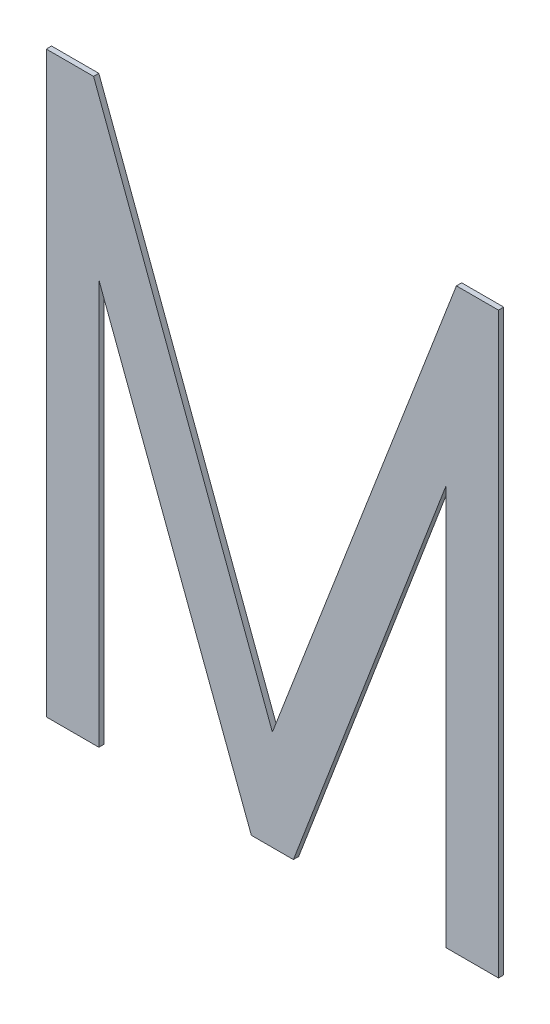
ISO-10303-21;
HEADER;
FILE_DESCRIPTION(('STEP AP214'),'2;1');
FILE_NAME('part.step','',(''),(''),'','','');
FILE_SCHEMA(('AUTOMOTIVE_DESIGN { 1 0 10303 214 1 1 1 1 }'));
ENDSEC;
DATA;
#1=APPLICATION_CONTEXT('core data for automotive mechanical design processes');
#2=APPLICATION_PROTOCOL_DEFINITION('international standard','automotive_design',2000,#1);
#3=PRODUCT_CONTEXT('',#1,'mechanical');
#4=PRODUCT('Part','Part','',(#3));
#5=PRODUCT_RELATED_PRODUCT_CATEGORY('part','',(#4));
#6=PRODUCT_DEFINITION_FORMATION('','',#4);
#7=PRODUCT_DEFINITION_CONTEXT('part definition',#1,'design');
#8=PRODUCT_DEFINITION('design','',#6,#7);
#9=PRODUCT_DEFINITION_SHAPE('','',#8);
#10=(LENGTH_UNIT() NAMED_UNIT(*) SI_UNIT(.MILLI.,.METRE.));
#11=(NAMED_UNIT(*) PLANE_ANGLE_UNIT() SI_UNIT($,.RADIAN.));
#12=(NAMED_UNIT(*) SI_UNIT($,.STERADIAN.) SOLID_ANGLE_UNIT());
#13=UNCERTAINTY_MEASURE_WITH_UNIT(LENGTH_MEASURE(1.E-05),#10,'distance_accuracy_value','');
#14=(GEOMETRIC_REPRESENTATION_CONTEXT(3) GLOBAL_UNCERTAINTY_ASSIGNED_CONTEXT((#13)) GLOBAL_UNIT_ASSIGNED_CONTEXT((#10,
#11,#12)) REPRESENTATION_CONTEXT('',''));
#15=CARTESIAN_POINT('',(0.,0.,0.));
#16=DIRECTION('',(0.,0.,1.));
#17=DIRECTION('',(1.,0.,0.));
#18=AXIS2_PLACEMENT_3D('',#15,#16,#17);
#19=CARTESIAN_POINT('',(-0.42999914,-0.5499989,0.01));
#20=DIRECTION('',(0.,0.,1.));
#21=DIRECTION('',(1.,0.,0.));
#22=AXIS2_PLACEMENT_3D('',#19,#20,#21);
#23=PLANE('',#22);
#24=DIRECTION('',(1.,0.,0.));
#25=VECTOR('',#24,1.);
#26=CARTESIAN_POINT('',(-0.42999914,0.55000144,0.01));
#27=LINE('',#26,#25);
#28=CARTESIAN_POINT('',(-0.42999914,0.55000144,0.01));
#29=VERTEX_POINT('',#28);
#30=CARTESIAN_POINT('',(-0.33999932,0.55000144,0.01));
#31=VERTEX_POINT('',#30);
#32=EDGE_CURVE('E167',#29,#31,#27,.T.);
#33=ORIENTED_EDGE('',*,*,#32,.F.);
#34=DIRECTION('',(0.,1.,0.));
#35=VECTOR('',#34,1.);
#36=CARTESIAN_POINT('',(-0.42999914,-0.5499989,0.01));
#37=LINE('',#36,#35);
#38=CARTESIAN_POINT('',(-0.42999914,-0.5499989,0.01));
#39=VERTEX_POINT('',#38);
#40=EDGE_CURVE('E124',#39,#29,#37,.T.);
#41=ORIENTED_EDGE('',*,*,#40,.F.);
#42=DIRECTION('',(1.,0.,0.));
#43=VECTOR('',#42,1.);
#44=CARTESIAN_POINT('',(-0.32999934,-0.5499989,0.01));
#45=LINE('',#44,#43);
#46=CARTESIAN_POINT('',(-0.32999934,-0.5499989,0.01));
#47=VERTEX_POINT('',#46);
#48=EDGE_CURVE('E20',#47,#39,#45,.F.);
#49=ORIENTED_EDGE('',*,*,#48,.F.);
#50=DIRECTION('',(0.,1.,0.));
#51=VECTOR('',#50,1.);
#52=CARTESIAN_POINT('',(-0.32999934,0.2200021,0.01));
#53=LINE('',#52,#51);
#54=CARTESIAN_POINT('',(-0.329999339999934,0.220002100000025,0.01));
#55=VERTEX_POINT('',#54);
#56=EDGE_CURVE('E113',#55,#47,#53,.F.);
#57=ORIENTED_EDGE('',*,*,#56,.F.);
#58=DIRECTION('',(0.352453971735885,-0.935829149902695,0.));
#59=VECTOR('',#58,1.);
#60=CARTESIAN_POINT('',(-0.03999991999999,-0.5499989,0.01));
#61=LINE('',#60,#59);
#62=CARTESIAN_POINT('',(-0.03999991999999,-0.5499989,0.01));
#63=VERTEX_POINT('',#62);
#64=EDGE_CURVE('E108',#63,#55,#61,.F.);
#65=ORIENTED_EDGE('',*,*,#64,.F.);
#66=DIRECTION('',(1.,0.,0.));
#67=VECTOR('',#66,1.);
#68=CARTESIAN_POINT('',(0.03999992000001,-0.5499989,0.01));
#69=LINE('',#68,#67);
#70=CARTESIAN_POINT('',(0.0399999199999626,-0.549998899999982,0.01));
#71=VERTEX_POINT('',#70);
#72=EDGE_CURVE('E135',#71,#63,#69,.F.);
#73=ORIENTED_EDGE('',*,*,#72,.F.);
#74=DIRECTION('',(0.356505441932937,0.934293246187834,0.));
#75=VECTOR('',#74,1.);
#76=CARTESIAN_POINT('',(0.32999934,0.21000212,0.01));
#77=LINE('',#76,#75);
#78=CARTESIAN_POINT('',(0.32999934,0.21000212,0.01));
#79=VERTEX_POINT('',#78);
#80=EDGE_CURVE('E139',#79,#71,#77,.F.);
#81=ORIENTED_EDGE('',*,*,#80,.F.);
#82=DIRECTION('',(0.,1.,0.));
#83=VECTOR('',#82,1.);
#84=CARTESIAN_POINT('',(0.32999934,-0.5499989,0.01));
#85=LINE('',#84,#83);
#86=CARTESIAN_POINT('',(0.32999934,-0.5499989,0.01));
#87=VERTEX_POINT('',#86);
#88=EDGE_CURVE('E143',#87,#79,#85,.T.);
#89=ORIENTED_EDGE('',*,*,#88,.F.);
#90=DIRECTION('',(1.,0.,0.));
#91=VECTOR('',#90,1.);
#92=CARTESIAN_POINT('',(0.42999914,-0.5499989,0.01));
#93=LINE('',#92,#91);
#94=CARTESIAN_POINT('',(0.42999914,-0.5499989,0.01));
#95=VERTEX_POINT('',#94);
#96=EDGE_CURVE('E147',#95,#87,#93,.F.);
#97=ORIENTED_EDGE('',*,*,#96,.F.);
#98=DIRECTION('',(0.,1.,0.));
#99=VECTOR('',#98,1.);
#100=CARTESIAN_POINT('',(0.42999914,0.55000144,0.01));
#101=LINE('',#100,#99);
#102=CARTESIAN_POINT('',(0.42999914,0.55000144,0.01));
#103=VERTEX_POINT('',#102);
#104=EDGE_CURVE('E151',#103,#95,#101,.F.);
#105=ORIENTED_EDGE('',*,*,#104,.F.);
#106=DIRECTION('',(1.,0.,0.));
#107=VECTOR('',#106,1.);
#108=CARTESIAN_POINT('',(0.3499993,0.55000144,0.01));
#109=LINE('',#108,#107);
#110=CARTESIAN_POINT('',(0.349999299999946,0.550001440000021,0.01));
#111=VERTEX_POINT('',#110);
#112=EDGE_CURVE('E155',#111,#103,#109,.T.);
#113=ORIENTED_EDGE('',*,*,#112,.F.);
#114=DIRECTION('',(-0.358978206445155,-0.933345941919404,0.));
#115=VECTOR('',#114,1.);
#116=CARTESIAN_POINT('',(0.,-0.35999928,0.01));
#117=LINE('',#116,#115);
#118=CARTESIAN_POINT('',(0.,-0.359999279999984,0.01));
#119=VERTEX_POINT('',#118);
#120=EDGE_CURVE('E159',#119,#111,#117,.F.);
#121=ORIENTED_EDGE('',*,*,#120,.F.);
#122=DIRECTION('',(-0.349994222880141,0.936751858258379,0.));
#123=VECTOR('',#122,1.);
#124=CARTESIAN_POINT('',(-0.33999932,0.55000144,0.01));
#125=LINE('',#124,#123);
#126=EDGE_CURVE('E163',#31,#119,#125,.F.);
#127=ORIENTED_EDGE('',*,*,#126,.F.);
#128=EDGE_LOOP('',(#33,#41,#49,#57,#65,#73,#81,#89,#97,#105,#113,#121,#127));
#129=FACE_BOUND('',#128,.T.);
#130=ADVANCED_FACE('F17',(#129),#23,.T.);
#131=CARTESIAN_POINT('',(-0.32999934,-0.5499989,0.));
#132=DIRECTION('',(0.,-1.,0.));
#133=DIRECTION('',(0.,0.,-1.));
#134=AXIS2_PLACEMENT_3D('',#131,#132,#133);
#135=PLANE('',#134);
#136=DIRECTION('',(0.,0.,1.));
#137=VECTOR('',#136,1.);
#138=CARTESIAN_POINT('',(-0.42999914,-0.5499989,0.));
#139=LINE('',#138,#137);
#140=CARTESIAN_POINT('',(-0.42999914,-0.5499989,0.));
#141=VERTEX_POINT('',#140);
#142=EDGE_CURVE('E171',#141,#39,#139,.T.);
#143=ORIENTED_EDGE('',*,*,#142,.F.);
#144=DIRECTION('',(1.,0.,0.));
#145=VECTOR('',#144,1.);
#146=CARTESIAN_POINT('',(-0.42999914,-0.5499989,0.));
#147=LINE('',#146,#145);
#148=CARTESIAN_POINT('',(-0.32999934,-0.5499989,0.));
#149=VERTEX_POINT('',#148);
#150=EDGE_CURVE('E130',#141,#149,#147,.T.);
#151=ORIENTED_EDGE('',*,*,#150,.T.);
#152=DIRECTION('',(0.,0.,-1.));
#153=VECTOR('',#152,1.);
#154=CARTESIAN_POINT('',(-0.32999934,-0.5499989,0.));
#155=LINE('',#154,#153);
#156=EDGE_CURVE('E118',#47,#149,#155,.T.);
#157=ORIENTED_EDGE('',*,*,#156,.F.);
#158=ORIENTED_EDGE('',*,*,#48,.T.);
#159=EDGE_LOOP('',(#143,#151,#157,#158));
#160=FACE_BOUND('',#159,.T.);
#161=ADVANCED_FACE('F129',(#160),#135,.T.);
#162=CARTESIAN_POINT('',(-0.32999934,0.2200021,0.));
#163=DIRECTION('',(1.,0.,0.));
#164=DIRECTION('',(0.,0.,-1.));
#165=AXIS2_PLACEMENT_3D('',#162,#163,#164);
#166=PLANE('',#165);
#167=ORIENTED_EDGE('',*,*,#156,.T.);
#168=DIRECTION('',(0.,1.,0.));
#169=VECTOR('',#168,1.);
#170=CARTESIAN_POINT('',(-0.32999934,-0.5499989,0.));
#171=LINE('',#170,#169);
#172=CARTESIAN_POINT('',(-0.329999339999934,0.220002100000025,0.));
#173=VERTEX_POINT('',#172);
#174=EDGE_CURVE('E176',#149,#173,#171,.T.);
#175=ORIENTED_EDGE('',*,*,#174,.T.);
#176=DIRECTION('',(0.,0.,1.));
#177=VECTOR('',#176,1.);
#178=CARTESIAN_POINT('',(-0.329999339999737,0.220002100000099,0.));
#179=LINE('',#178,#177);
#180=EDGE_CURVE('E120',#55,#173,#179,.F.);
#181=ORIENTED_EDGE('',*,*,#180,.F.);
#182=ORIENTED_EDGE('',*,*,#56,.T.);
#183=EDGE_LOOP('',(#167,#175,#181,#182));
#184=FACE_BOUND('',#183,.T.);
#185=ADVANCED_FACE('F115',(#184),#166,.T.);
#186=CARTESIAN_POINT('',(-0.03999991999999,-0.5499989,0.));
#187=DIRECTION('',(-0.935829149902695,-0.352453971735885,0.));
#188=DIRECTION('',(0.352453971735885,-0.935829149902695,0.));
#189=AXIS2_PLACEMENT_3D('',#186,#187,#188);
#190=PLANE('',#189);
#191=ORIENTED_EDGE('',*,*,#180,.T.);
#192=DIRECTION('',(0.352453971736204,-0.935829149902574,0.));
#193=VECTOR('',#192,1.);
#194=CARTESIAN_POINT('',(-0.32999934,0.2200021,0.));
#195=LINE('',#194,#193);
#196=CARTESIAN_POINT('',(-0.03999991999999,-0.5499989,0.));
#197=VERTEX_POINT('',#196);
#198=EDGE_CURVE('E178',#173,#197,#195,.T.);
#199=ORIENTED_EDGE('',*,*,#198,.T.);
#200=DIRECTION('',(0.,0.,-1.));
#201=VECTOR('',#200,1.);
#202=CARTESIAN_POINT('',(-0.03999991999999,-0.5499989,0.));
#203=LINE('',#202,#201);
#204=EDGE_CURVE('E137',#63,#197,#203,.T.);
#205=ORIENTED_EDGE('',*,*,#204,.F.);
#206=ORIENTED_EDGE('',*,*,#64,.T.);
#207=EDGE_LOOP('',(#191,#199,#205,#206));
#208=FACE_BOUND('',#207,.T.);
#209=ADVANCED_FACE('F252',(#208),#190,.T.);
#210=CARTESIAN_POINT('',(0.03999992000001,-0.5499989,0.));
#211=DIRECTION('',(0.,-1.,0.));
#212=DIRECTION('',(0.,0.,-1.));
#213=AXIS2_PLACEMENT_3D('',#210,#211,#212);
#214=PLANE('',#213);
#215=ORIENTED_EDGE('',*,*,#204,.T.);
#216=DIRECTION('',(1.,0.,0.));
#217=VECTOR('',#216,1.);
#218=CARTESIAN_POINT('',(-0.42999914,-0.5499989,0.));
#219=LINE('',#218,#217);
#220=CARTESIAN_POINT('',(0.0399999199999626,-0.549998899999982,0.));
#221=VERTEX_POINT('',#220);
#222=EDGE_CURVE('E181',#197,#221,#219,.T.);
#223=ORIENTED_EDGE('',*,*,#222,.T.);
#224=DIRECTION('',(0.,0.,1.));
#225=VECTOR('',#224,1.);
#226=CARTESIAN_POINT('',(0.0399999199998204,-0.549998899999928,0.));
#227=LINE('',#226,#225);
#228=EDGE_CURVE('E141',#71,#221,#227,.F.);
#229=ORIENTED_EDGE('',*,*,#228,.F.);
#230=ORIENTED_EDGE('',*,*,#72,.T.);
#231=EDGE_LOOP('',(#215,#223,#229,#230));
#232=FACE_BOUND('',#231,.T.);
#233=ADVANCED_FACE('F250',(#232),#214,.T.);
#234=CARTESIAN_POINT('',(0.32999934,0.21000212,0.));
#235=DIRECTION('',(0.934293246187834,-0.356505441932937,0.));
#236=DIRECTION('',(0.356505441932937,0.934293246187834,0.));
#237=AXIS2_PLACEMENT_3D('',#234,#235,#236);
#238=PLANE('',#237);
#239=ORIENTED_EDGE('',*,*,#228,.T.);
#240=DIRECTION('',(0.356505441932704,0.934293246187923,0.));
#241=VECTOR('',#240,1.);
#242=CARTESIAN_POINT('',(0.03999992000001,-0.5499989,0.));
#243=LINE('',#242,#241);
#244=CARTESIAN_POINT('',(0.32999934,0.21000212,0.));
#245=VERTEX_POINT('',#244);
#246=EDGE_CURVE('E184',#221,#245,#243,.T.);
#247=ORIENTED_EDGE('',*,*,#246,.T.);
#248=DIRECTION('',(0.,0.,1.));
#249=VECTOR('',#248,1.);
#250=CARTESIAN_POINT('',(0.32999934,0.21000212,0.));
#251=LINE('',#250,#249);
#252=EDGE_CURVE('E145',#79,#245,#251,.F.);
#253=ORIENTED_EDGE('',*,*,#252,.F.);
#254=ORIENTED_EDGE('',*,*,#80,.T.);
#255=EDGE_LOOP('',(#239,#247,#253,#254));
#256=FACE_BOUND('',#255,.T.);
#257=ADVANCED_FACE('F246',(#256),#238,.T.);
#258=CARTESIAN_POINT('',(0.32999934,-0.5499989,0.));
#259=DIRECTION('',(-1.,0.,0.));
#260=DIRECTION('',(0.,0.,1.));
#261=AXIS2_PLACEMENT_3D('',#258,#259,#260);
#262=PLANE('',#261);
#263=ORIENTED_EDGE('',*,*,#252,.T.);
#264=DIRECTION('',(0.,1.,0.));
#265=VECTOR('',#264,1.);
#266=CARTESIAN_POINT('',(0.32999934,-0.5499989,0.));
#267=LINE('',#266,#265);
#268=CARTESIAN_POINT('',(0.32999934,-0.5499989,0.));
#269=VERTEX_POINT('',#268);
#270=EDGE_CURVE('E187',#245,#269,#267,.F.);
#271=ORIENTED_EDGE('',*,*,#270,.T.);
#272=DIRECTION('',(0.,0.,-1.));
#273=VECTOR('',#272,1.);
#274=CARTESIAN_POINT('',(0.32999934,-0.5499989,0.));
#275=LINE('',#274,#273);
#276=EDGE_CURVE('E149',#87,#269,#275,.T.);
#277=ORIENTED_EDGE('',*,*,#276,.F.);
#278=ORIENTED_EDGE('',*,*,#88,.T.);
#279=EDGE_LOOP('',(#263,#271,#277,#278));
#280=FACE_BOUND('',#279,.T.);
#281=ADVANCED_FACE('F240',(#280),#262,.T.);
#282=CARTESIAN_POINT('',(0.42999914,-0.5499989,0.));
#283=DIRECTION('',(0.,-1.,0.));
#284=DIRECTION('',(0.,0.,-1.));
#285=AXIS2_PLACEMENT_3D('',#282,#283,#284);
#286=PLANE('',#285);
#287=ORIENTED_EDGE('',*,*,#276,.T.);
#288=DIRECTION('',(1.,0.,0.));
#289=VECTOR('',#288,1.);
#290=CARTESIAN_POINT('',(-0.42999914,-0.5499989,0.));
#291=LINE('',#290,#289);
#292=CARTESIAN_POINT('',(0.42999914,-0.5499989,0.));
#293=VERTEX_POINT('',#292);
#294=EDGE_CURVE('E190',#269,#293,#291,.T.);
#295=ORIENTED_EDGE('',*,*,#294,.T.);
#296=DIRECTION('',(0.,0.,-1.));
#297=VECTOR('',#296,1.);
#298=CARTESIAN_POINT('',(0.42999914,-0.5499989,0.));
#299=LINE('',#298,#297);
#300=EDGE_CURVE('E153',#95,#293,#299,.T.);
#301=ORIENTED_EDGE('',*,*,#300,.F.);
#302=ORIENTED_EDGE('',*,*,#96,.T.);
#303=EDGE_LOOP('',(#287,#295,#301,#302));
#304=FACE_BOUND('',#303,.T.);
#305=ADVANCED_FACE('F236',(#304),#286,.T.);
#306=CARTESIAN_POINT('',(0.42999914,0.55000144,0.));
#307=DIRECTION('',(1.,0.,0.));
#308=DIRECTION('',(0.,0.,-1.));
#309=AXIS2_PLACEMENT_3D('',#306,#307,#308);
#310=PLANE('',#309);
#311=ORIENTED_EDGE('',*,*,#300,.T.);
#312=DIRECTION('',(0.,1.,0.));
#313=VECTOR('',#312,1.);
#314=CARTESIAN_POINT('',(0.42999914,-0.5499989,0.));
#315=LINE('',#314,#313);
#316=CARTESIAN_POINT('',(0.42999914,0.55000144,0.));
#317=VERTEX_POINT('',#316);
#318=EDGE_CURVE('E193',#293,#317,#315,.T.);
#319=ORIENTED_EDGE('',*,*,#318,.T.);
#320=DIRECTION('',(0.,0.,1.));
#321=VECTOR('',#320,1.);
#322=CARTESIAN_POINT('',(0.42999914,0.55000144,0.));
#323=LINE('',#322,#321);
#324=EDGE_CURVE('E157',#103,#317,#323,.F.);
#325=ORIENTED_EDGE('',*,*,#324,.F.);
#326=ORIENTED_EDGE('',*,*,#104,.T.);
#327=EDGE_LOOP('',(#311,#319,#325,#326));
#328=FACE_BOUND('',#327,.T.);
#329=ADVANCED_FACE('F230',(#328),#310,.T.);
#330=CARTESIAN_POINT('',(0.3499993,0.55000144,0.));
#331=DIRECTION('',(0.,1.,0.));
#332=DIRECTION('',(0.,0.,1.));
#333=AXIS2_PLACEMENT_3D('',#330,#331,#332);
#334=PLANE('',#333);
#335=ORIENTED_EDGE('',*,*,#324,.T.);
#336=DIRECTION('',(1.,0.,0.));
#337=VECTOR('',#336,1.);
#338=CARTESIAN_POINT('',(-0.42999914,0.55000144,0.));
#339=LINE('',#338,#337);
#340=CARTESIAN_POINT('',(0.349999299999946,0.550001440000021,0.));
#341=VERTEX_POINT('',#340);
#342=EDGE_CURVE('E196',#317,#341,#339,.F.);
#343=ORIENTED_EDGE('',*,*,#342,.T.);
#344=DIRECTION('',(0.,0.,1.));
#345=VECTOR('',#344,1.);
#346=CARTESIAN_POINT('',(0.349999299999783,0.550001440000083,0.));
#347=LINE('',#346,#345);
#348=EDGE_CURVE('E161',#111,#341,#347,.F.);
#349=ORIENTED_EDGE('',*,*,#348,.F.);
#350=ORIENTED_EDGE('',*,*,#112,.T.);
#351=EDGE_LOOP('',(#335,#343,#349,#350));
#352=FACE_BOUND('',#351,.T.);
#353=ADVANCED_FACE('F226',(#352),#334,.T.);
#354=CARTESIAN_POINT('',(0.,-0.35999928,0.));
#355=DIRECTION('',(-0.933345941919404,0.358978206445155,0.));
#356=DIRECTION('',(-0.358978206445155,-0.933345941919404,0.));
#357=AXIS2_PLACEMENT_3D('',#354,#355,#356);
#358=PLANE('',#357);
#359=ORIENTED_EDGE('',*,*,#348,.T.);
#360=DIRECTION('',(-0.358978206445378,-0.933345941919318,0.));
#361=VECTOR('',#360,1.);
#362=CARTESIAN_POINT('',(0.3499993,0.55000144,0.));
#363=LINE('',#362,#361);
#364=CARTESIAN_POINT('',(0.,-0.359999279999984,0.));
#365=VERTEX_POINT('',#364);
#366=EDGE_CURVE('E199',#341,#365,#363,.T.);
#367=ORIENTED_EDGE('',*,*,#366,.T.);
#368=DIRECTION('',(0.,0.,1.));
#369=VECTOR('',#368,1.);
#370=CARTESIAN_POINT('',(1.72388145425195E-13,-0.359999279999936,0.));
#371=LINE('',#370,#369);
#372=EDGE_CURVE('E165',#119,#365,#371,.F.);
#373=ORIENTED_EDGE('',*,*,#372,.F.);
#374=ORIENTED_EDGE('',*,*,#120,.T.);
#375=EDGE_LOOP('',(#359,#367,#373,#374));
#376=FACE_BOUND('',#375,.T.);
#377=ADVANCED_FACE('F220',(#376),#358,.T.);
#378=CARTESIAN_POINT('',(-0.33999932,0.55000144,0.));
#379=DIRECTION('',(0.936751858258379,0.349994222880141,0.));
#380=DIRECTION('',(-0.349994222880141,0.936751858258379,0.));
#381=AXIS2_PLACEMENT_3D('',#378,#379,#380);
#382=PLANE('',#381);
#383=ORIENTED_EDGE('',*,*,#372,.T.);
#384=DIRECTION('',(-0.349994222879964,0.936751858258445,0.));
#385=VECTOR('',#384,1.);
#386=CARTESIAN_POINT('',(0.,-0.35999928,0.));
#387=LINE('',#386,#385);
#388=CARTESIAN_POINT('',(-0.33999932,0.55000144,0.));
#389=VERTEX_POINT('',#388);
#390=EDGE_CURVE('E202',#365,#389,#387,.T.);
#391=ORIENTED_EDGE('',*,*,#390,.T.);
#392=DIRECTION('',(0.,0.,1.));
#393=VECTOR('',#392,1.);
#394=CARTESIAN_POINT('',(-0.33999932,0.55000144,0.));
#395=LINE('',#394,#393);
#396=EDGE_CURVE('E169',#31,#389,#395,.F.);
#397=ORIENTED_EDGE('',*,*,#396,.F.);
#398=ORIENTED_EDGE('',*,*,#126,.T.);
#399=EDGE_LOOP('',(#383,#391,#397,#398));
#400=FACE_BOUND('',#399,.T.);
#401=ADVANCED_FACE('F215',(#400),#382,.T.);
#402=CARTESIAN_POINT('',(-0.42999914,0.55000144,0.));
#403=DIRECTION('',(0.,1.,0.));
#404=DIRECTION('',(0.,0.,1.));
#405=AXIS2_PLACEMENT_3D('',#402,#403,#404);
#406=PLANE('',#405);
#407=ORIENTED_EDGE('',*,*,#396,.T.);
#408=DIRECTION('',(1.,0.,0.));
#409=VECTOR('',#408,1.);
#410=CARTESIAN_POINT('',(-0.42999914,0.55000144,0.));
#411=LINE('',#410,#409);
#412=CARTESIAN_POINT('',(-0.42999914,0.55000144,0.));
#413=VERTEX_POINT('',#412);
#414=EDGE_CURVE('E26',#389,#413,#411,.F.);
#415=ORIENTED_EDGE('',*,*,#414,.T.);
#416=DIRECTION('',(0.,0.,1.));
#417=VECTOR('',#416,1.);
#418=CARTESIAN_POINT('',(-0.42999914,0.55000144,0.));
#419=LINE('',#418,#417);
#420=EDGE_CURVE('E34',#29,#413,#419,.F.);
#421=ORIENTED_EDGE('',*,*,#420,.F.);
#422=ORIENTED_EDGE('',*,*,#32,.T.);
#423=EDGE_LOOP('',(#407,#415,#421,#422));
#424=FACE_BOUND('',#423,.T.);
#425=ADVANCED_FACE('F208',(#424),#406,.T.);
#426=CARTESIAN_POINT('',(-0.42999914,-0.5499989,0.));
#427=DIRECTION('',(-1.,0.,0.));
#428=DIRECTION('',(0.,0.,1.));
#429=AXIS2_PLACEMENT_3D('',#426,#427,#428);
#430=PLANE('',#429);
#431=ORIENTED_EDGE('',*,*,#420,.T.);
#432=DIRECTION('',(0.,1.,0.));
#433=VECTOR('',#432,1.);
#434=CARTESIAN_POINT('',(-0.42999914,-0.5499989,0.));
#435=LINE('',#434,#433);
#436=EDGE_CURVE('E11',#413,#141,#435,.F.);
#437=ORIENTED_EDGE('',*,*,#436,.T.);
#438=ORIENTED_EDGE('',*,*,#142,.T.);
#439=ORIENTED_EDGE('',*,*,#40,.T.);
#440=EDGE_LOOP('',(#431,#437,#438,#439));
#441=FACE_BOUND('',#440,.T.);
#442=ADVANCED_FACE('F263',(#441),#430,.T.);
#443=CARTESIAN_POINT('',(-0.42999914,-0.5499989,0.));
#444=DIRECTION('',(0.,0.,1.));
#445=DIRECTION('',(1.,0.,0.));
#446=AXIS2_PLACEMENT_3D('',#443,#444,#445);
#447=PLANE('',#446);
#448=ORIENTED_EDGE('',*,*,#414,.F.);
#449=ORIENTED_EDGE('',*,*,#390,.F.);
#450=ORIENTED_EDGE('',*,*,#366,.F.);
#451=ORIENTED_EDGE('',*,*,#342,.F.);
#452=ORIENTED_EDGE('',*,*,#318,.F.);
#453=ORIENTED_EDGE('',*,*,#294,.F.);
#454=ORIENTED_EDGE('',*,*,#270,.F.);
#455=ORIENTED_EDGE('',*,*,#246,.F.);
#456=ORIENTED_EDGE('',*,*,#222,.F.);
#457=ORIENTED_EDGE('',*,*,#198,.F.);
#458=ORIENTED_EDGE('',*,*,#174,.F.);
#459=ORIENTED_EDGE('',*,*,#150,.F.);
#460=ORIENTED_EDGE('',*,*,#436,.F.);
#461=EDGE_LOOP('',(#448,#449,#450,#451,#452,#453,#454,#455,#456,#457,#458,#459,#460));
#462=FACE_BOUND('',#461,.T.);
#463=ADVANCED_FACE('F212',(#462),#447,.F.);
#464=CLOSED_SHELL('',(#130,#161,#185,#209,#233,#257,#281,#305,#329,#353,#377,#401,#425,#442,#463));
#465=MANIFOLD_SOLID_BREP('B1',#464);
#466=ADVANCED_BREP_SHAPE_REPRESENTATION('',(#18,#465),#14);
#467=SHAPE_DEFINITION_REPRESENTATION(#9,#466);
ENDSEC;
END-ISO-10303-21;
